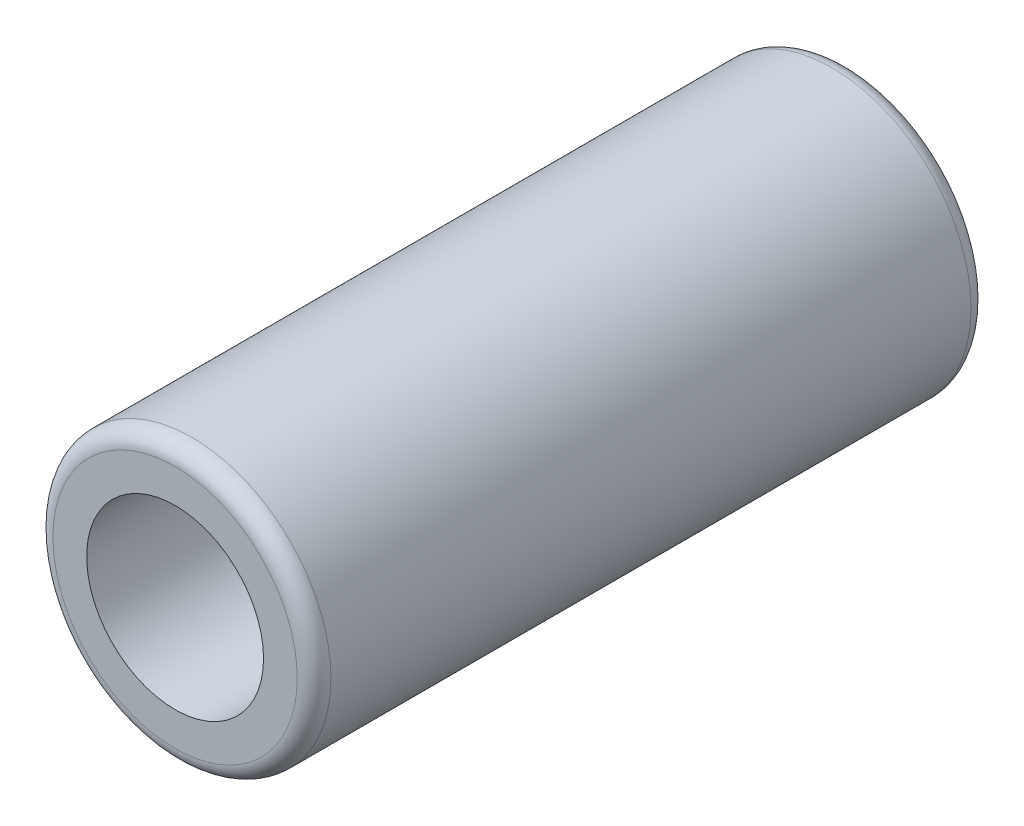
ISO-10303-21;
HEADER;
FILE_DESCRIPTION(('STEP AP214'),'2;1');
FILE_NAME('part.step','',(''),(''),'','','');
FILE_SCHEMA(('AUTOMOTIVE_DESIGN { 1 0 10303 214 1 1 1 1 }'));
ENDSEC;
DATA;
#1=APPLICATION_CONTEXT('core data for automotive mechanical design processes');
#2=APPLICATION_PROTOCOL_DEFINITION('international standard','automotive_design',2000,#1);
#3=PRODUCT_CONTEXT('',#1,'mechanical');
#4=PRODUCT('Part','Part','',(#3));
#5=PRODUCT_RELATED_PRODUCT_CATEGORY('part','',(#4));
#6=PRODUCT_DEFINITION_FORMATION('','',#4);
#7=PRODUCT_DEFINITION_CONTEXT('part definition',#1,'design');
#8=PRODUCT_DEFINITION('design','',#6,#7);
#9=PRODUCT_DEFINITION_SHAPE('','',#8);
#10=(LENGTH_UNIT() NAMED_UNIT(*) SI_UNIT(.MILLI.,.METRE.));
#11=(NAMED_UNIT(*) PLANE_ANGLE_UNIT() SI_UNIT($,.RADIAN.));
#12=(NAMED_UNIT(*) SI_UNIT($,.STERADIAN.) SOLID_ANGLE_UNIT());
#13=UNCERTAINTY_MEASURE_WITH_UNIT(LENGTH_MEASURE(1.E-05),#10,'distance_accuracy_value','');
#14=(GEOMETRIC_REPRESENTATION_CONTEXT(3) GLOBAL_UNCERTAINTY_ASSIGNED_CONTEXT((#13)) GLOBAL_UNIT_ASSIGNED_CONTEXT((#10,
#11,#12)) REPRESENTATION_CONTEXT('',''));
#15=CARTESIAN_POINT('',(0.,0.,0.));
#16=DIRECTION('',(0.,0.,1.));
#17=DIRECTION('',(1.,0.,0.));
#18=AXIS2_PLACEMENT_3D('',#15,#16,#17);
#19=CARTESIAN_POINT('',(0.,0.,40.));
#20=DIRECTION('',(0.,0.,1.));
#21=DIRECTION('',(1.,0.,0.));
#22=AXIS2_PLACEMENT_3D('',#19,#20,#21);
#23=PLANE('',#22);
#24=CARTESIAN_POINT('',(0.,0.,40.));
#25=DIRECTION('',(0.,0.,1.));
#26=DIRECTION('',(1.,0.,0.));
#27=AXIS2_PLACEMENT_3D('',#24,#25,#26);
#28=CIRCLE('',#27,7.25);
#29=CARTESIAN_POINT('',(7.25,0.,40.));
#30=VERTEX_POINT('',#29);
#31=EDGE_CURVE('E10',#30,#30,#28,.T.);
#32=ORIENTED_EDGE('',*,*,#31,.T.);
#33=EDGE_LOOP('',(#32));
#34=FACE_BOUND('',#33,.T.);
#35=CARTESIAN_POINT('',(0.,0.,40.));
#36=DIRECTION('',(0.,0.,1.));
#37=DIRECTION('',(1.,0.,0.));
#38=AXIS2_PLACEMENT_3D('',#35,#36,#37);
#39=CIRCLE('',#38,5.25);
#40=CARTESIAN_POINT('',(5.25,0.,40.));
#41=VERTEX_POINT('',#40);
#42=EDGE_CURVE('E50',#41,#41,#39,.T.);
#43=ORIENTED_EDGE('',*,*,#42,.F.);
#44=EDGE_LOOP('',(#43));
#45=FACE_BOUND('',#44,.T.);
#46=ADVANCED_FACE('F30',(#34,#45),#23,.T.);
#47=CARTESIAN_POINT('',(0.,0.,0.));
#48=DIRECTION('',(0.,0.,1.));
#49=DIRECTION('',(1.,0.,0.));
#50=AXIS2_PLACEMENT_3D('',#47,#48,#49);
#51=PLANE('',#50);
#52=CARTESIAN_POINT('',(0.,0.,0.));
#53=DIRECTION('',(0.,0.,1.));
#54=DIRECTION('',(1.,0.,0.));
#55=AXIS2_PLACEMENT_3D('',#52,#53,#54);
#56=CIRCLE('',#55,7.25);
#57=CARTESIAN_POINT('',(7.25,0.,0.));
#58=VERTEX_POINT('',#57);
#59=EDGE_CURVE('E37',#58,#58,#56,.F.);
#60=ORIENTED_EDGE('',*,*,#59,.T.);
#61=EDGE_LOOP('',(#60));
#62=FACE_BOUND('',#61,.T.);
#63=CARTESIAN_POINT('',(0.,0.,0.));
#64=DIRECTION('',(0.,0.,1.));
#65=DIRECTION('',(1.,0.,0.));
#66=AXIS2_PLACEMENT_3D('',#63,#64,#65);
#67=CIRCLE('',#66,5.25);
#68=CARTESIAN_POINT('',(5.25,0.,0.));
#69=VERTEX_POINT('',#68);
#70=EDGE_CURVE('E51',#69,#69,#67,.T.);
#71=ORIENTED_EDGE('',*,*,#70,.T.);
#72=EDGE_LOOP('',(#71));
#73=FACE_BOUND('',#72,.T.);
#74=ADVANCED_FACE('F61',(#62,#73),#51,.F.);
#75=CARTESIAN_POINT('',(0.,0.,40.));
#76=DIRECTION('',(0.,0.,-1.));
#77=DIRECTION('',(-1.,0.,0.));
#78=AXIS2_PLACEMENT_3D('',#75,#76,#77);
#79=CYLINDRICAL_SURFACE('',#78,8.25);
#80=CARTESIAN_POINT('',(0.,0.,1.));
#81=DIRECTION('',(0.,0.,1.));
#82=DIRECTION('',(1.,0.,0.));
#83=AXIS2_PLACEMENT_3D('',#80,#81,#82);
#84=CIRCLE('',#83,8.25);
#85=CARTESIAN_POINT('',(8.25,0.,1.));
#86=VERTEX_POINT('',#85);
#87=EDGE_CURVE('E41',#86,#86,#84,.T.);
#88=ORIENTED_EDGE('',*,*,#87,.T.);
#89=EDGE_LOOP('',(#88));
#90=FACE_BOUND('',#89,.T.);
#91=CARTESIAN_POINT('',(0.,0.,39.));
#92=DIRECTION('',(0.,0.,1.));
#93=DIRECTION('',(1.,0.,0.));
#94=AXIS2_PLACEMENT_3D('',#91,#92,#93);
#95=CIRCLE('',#94,8.25);
#96=CARTESIAN_POINT('',(8.25,0.,39.));
#97=VERTEX_POINT('',#96);
#98=EDGE_CURVE('E45',#97,#97,#95,.F.);
#99=ORIENTED_EDGE('',*,*,#98,.T.);
#100=EDGE_LOOP('',(#99));
#101=FACE_BOUND('',#100,.T.);
#102=ADVANCED_FACE('F66',(#90,#101),#79,.T.);
#103=CARTESIAN_POINT('',(0.,0.,40.));
#104=DIRECTION('',(0.,0.,-1.));
#105=DIRECTION('',(-1.,0.,0.));
#106=AXIS2_PLACEMENT_3D('',#103,#104,#105);
#107=CYLINDRICAL_SURFACE('',#106,5.25);
#108=ORIENTED_EDGE('',*,*,#42,.T.);
#109=EDGE_LOOP('',(#108));
#110=FACE_BOUND('',#109,.T.);
#111=ORIENTED_EDGE('',*,*,#70,.F.);
#112=EDGE_LOOP('',(#111));
#113=FACE_BOUND('',#112,.T.);
#114=ADVANCED_FACE('F57',(#110,#113),#107,.F.);
#115=CARTESIAN_POINT('',(0.,0.,1.));
#116=DIRECTION('',(0.,0.,1.));
#117=DIRECTION('',(1.,0.,0.));
#118=AXIS2_PLACEMENT_3D('',#115,#116,#117);
#119=TOROIDAL_SURFACE('',#118,7.25,1.);
#120=ORIENTED_EDGE('',*,*,#59,.F.);
#121=EDGE_LOOP('',(#120));
#122=FACE_BOUND('',#121,.T.);
#123=ORIENTED_EDGE('',*,*,#87,.F.);
#124=EDGE_LOOP('',(#123));
#125=FACE_BOUND('',#124,.T.);
#126=ADVANCED_FACE('F72',(#122,#125),#119,.T.);
#127=CARTESIAN_POINT('',(0.,0.,39.));
#128=DIRECTION('',(0.,0.,1.));
#129=DIRECTION('',(1.,0.,0.));
#130=AXIS2_PLACEMENT_3D('',#127,#128,#129);
#131=TOROIDAL_SURFACE('',#130,7.25,1.);
#132=ORIENTED_EDGE('',*,*,#98,.F.);
#133=EDGE_LOOP('',(#132));
#134=FACE_BOUND('',#133,.T.);
#135=ORIENTED_EDGE('',*,*,#31,.F.);
#136=EDGE_LOOP('',(#135));
#137=FACE_BOUND('',#136,.T.);
#138=ADVANCED_FACE('F32',(#134,#137),#131,.T.);
#139=CLOSED_SHELL('',(#46,#74,#102,#114,#126,#138));
#140=MANIFOLD_SOLID_BREP('B2',#139);
#141=ADVANCED_BREP_SHAPE_REPRESENTATION('',(#18,#140),#14);
#142=SHAPE_DEFINITION_REPRESENTATION(#9,#141);
ENDSEC;
END-ISO-10303-21;
